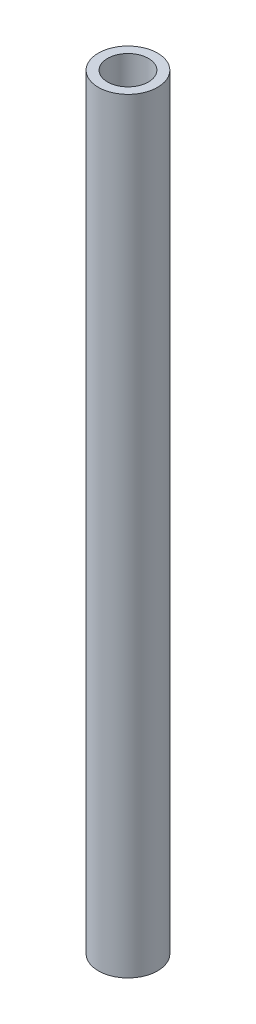
ISO-10303-21;
HEADER;
FILE_DESCRIPTION(('STEP AP214'),'2;1');
FILE_NAME('part.step','',(''),(''),'','','');
FILE_SCHEMA(('AUTOMOTIVE_DESIGN { 1 0 10303 214 1 1 1 1 }'));
ENDSEC;
DATA;
#1=APPLICATION_CONTEXT('core data for automotive mechanical design processes');
#2=APPLICATION_PROTOCOL_DEFINITION('international standard','automotive_design',2000,#1);
#3=PRODUCT_CONTEXT('',#1,'mechanical');
#4=PRODUCT('Part','Part','',(#3));
#5=PRODUCT_RELATED_PRODUCT_CATEGORY('part','',(#4));
#6=PRODUCT_DEFINITION_FORMATION('','',#4);
#7=PRODUCT_DEFINITION_CONTEXT('part definition',#1,'design');
#8=PRODUCT_DEFINITION('design','',#6,#7);
#9=PRODUCT_DEFINITION_SHAPE('','',#8);
#10=(LENGTH_UNIT() NAMED_UNIT(*) SI_UNIT(.MILLI.,.METRE.));
#11=(NAMED_UNIT(*) PLANE_ANGLE_UNIT() SI_UNIT($,.RADIAN.));
#12=(NAMED_UNIT(*) SI_UNIT($,.STERADIAN.) SOLID_ANGLE_UNIT());
#13=UNCERTAINTY_MEASURE_WITH_UNIT(LENGTH_MEASURE(1.E-05),#10,'distance_accuracy_value','');
#14=(GEOMETRIC_REPRESENTATION_CONTEXT(3) GLOBAL_UNCERTAINTY_ASSIGNED_CONTEXT((#13)) GLOBAL_UNIT_ASSIGNED_CONTEXT((#10,
#11,#12)) REPRESENTATION_CONTEXT('',''));
#15=CARTESIAN_POINT('',(0.,0.,0.));
#16=DIRECTION('',(0.,0.,1.));
#17=DIRECTION('',(1.,0.,0.));
#18=AXIS2_PLACEMENT_3D('',#15,#16,#17);
#19=CARTESIAN_POINT('',(0.,123.,0.));
#20=DIRECTION('',(0.,1.,0.));
#21=DIRECTION('',(0.,0.,1.));
#22=AXIS2_PLACEMENT_3D('',#19,#20,#21);
#23=PLANE('',#22);
#24=CARTESIAN_POINT('',(0.,123.,0.));
#25=DIRECTION('',(0.,1.,0.));
#26=DIRECTION('',(0.,0.,1.));
#27=AXIS2_PLACEMENT_3D('',#24,#25,#26);
#28=CIRCLE('',#27,4.7625);
#29=CARTESIAN_POINT('',(0.,123.,4.7625));
#30=VERTEX_POINT('',#29);
#31=EDGE_CURVE('E10',#30,#30,#28,.T.);
#32=ORIENTED_EDGE('',*,*,#31,.T.);
#33=EDGE_LOOP('',(#32));
#34=FACE_BOUND('',#33,.T.);
#35=CARTESIAN_POINT('',(0.,123.,0.));
#36=DIRECTION('',(0.,1.,0.));
#37=DIRECTION('',(0.,0.,1.));
#38=AXIS2_PLACEMENT_3D('',#35,#36,#37);
#39=CIRCLE('',#38,3.2893);
#40=CARTESIAN_POINT('',(0.,123.,3.2893));
#41=VERTEX_POINT('',#40);
#42=EDGE_CURVE('E41',#41,#41,#39,.T.);
#43=ORIENTED_EDGE('',*,*,#42,.F.);
#44=EDGE_LOOP('',(#43));
#45=FACE_BOUND('',#44,.T.);
#46=ADVANCED_FACE('F30',(#34,#45),#23,.T.);
#47=CARTESIAN_POINT('',(0.,0.,0.));
#48=DIRECTION('',(0.,1.,0.));
#49=DIRECTION('',(0.,0.,1.));
#50=AXIS2_PLACEMENT_3D('',#47,#48,#49);
#51=PLANE('',#50);
#52=CARTESIAN_POINT('',(0.,0.,0.));
#53=DIRECTION('',(0.,1.,0.));
#54=DIRECTION('',(0.,0.,1.));
#55=AXIS2_PLACEMENT_3D('',#52,#53,#54);
#56=CIRCLE('',#55,4.7625);
#57=CARTESIAN_POINT('',(0.,0.,4.7625));
#58=VERTEX_POINT('',#57);
#59=EDGE_CURVE('E34',#58,#58,#56,.T.);
#60=ORIENTED_EDGE('',*,*,#59,.F.);
#61=EDGE_LOOP('',(#60));
#62=FACE_BOUND('',#61,.T.);
#63=CARTESIAN_POINT('',(0.,0.,0.));
#64=DIRECTION('',(0.,1.,0.));
#65=DIRECTION('',(0.,0.,1.));
#66=AXIS2_PLACEMENT_3D('',#63,#64,#65);
#67=CIRCLE('',#66,3.2893);
#68=CARTESIAN_POINT('',(0.,0.,3.2893));
#69=VERTEX_POINT('',#68);
#70=EDGE_CURVE('E43',#69,#69,#67,.T.);
#71=ORIENTED_EDGE('',*,*,#70,.T.);
#72=EDGE_LOOP('',(#71));
#73=FACE_BOUND('',#72,.T.);
#74=ADVANCED_FACE('F53',(#62,#73),#51,.F.);
#75=CARTESIAN_POINT('',(0.,123.,0.));
#76=DIRECTION('',(0.,-1.,0.));
#77=DIRECTION('',(0.,0.,-1.));
#78=AXIS2_PLACEMENT_3D('',#75,#76,#77);
#79=CYLINDRICAL_SURFACE('',#78,4.7625);
#80=ORIENTED_EDGE('',*,*,#31,.F.);
#81=EDGE_LOOP('',(#80));
#82=FACE_BOUND('',#81,.T.);
#83=ORIENTED_EDGE('',*,*,#59,.T.);
#84=EDGE_LOOP('',(#83));
#85=FACE_BOUND('',#84,.T.);
#86=ADVANCED_FACE('F32',(#82,#85),#79,.T.);
#87=CARTESIAN_POINT('',(0.,123.,0.));
#88=DIRECTION('',(0.,-1.,0.));
#89=DIRECTION('',(0.,0.,-1.));
#90=AXIS2_PLACEMENT_3D('',#87,#88,#89);
#91=CYLINDRICAL_SURFACE('',#90,3.2893);
#92=ORIENTED_EDGE('',*,*,#42,.T.);
#93=EDGE_LOOP('',(#92));
#94=FACE_BOUND('',#93,.T.);
#95=ORIENTED_EDGE('',*,*,#70,.F.);
#96=EDGE_LOOP('',(#95));
#97=FACE_BOUND('',#96,.T.);
#98=ADVANCED_FACE('F49',(#94,#97),#91,.F.);
#99=CLOSED_SHELL('',(#46,#74,#86,#98));
#100=MANIFOLD_SOLID_BREP('B2',#99);
#101=ADVANCED_BREP_SHAPE_REPRESENTATION('',(#18,#100),#14);
#102=SHAPE_DEFINITION_REPRESENTATION(#9,#101);
ENDSEC;
END-ISO-10303-21;
